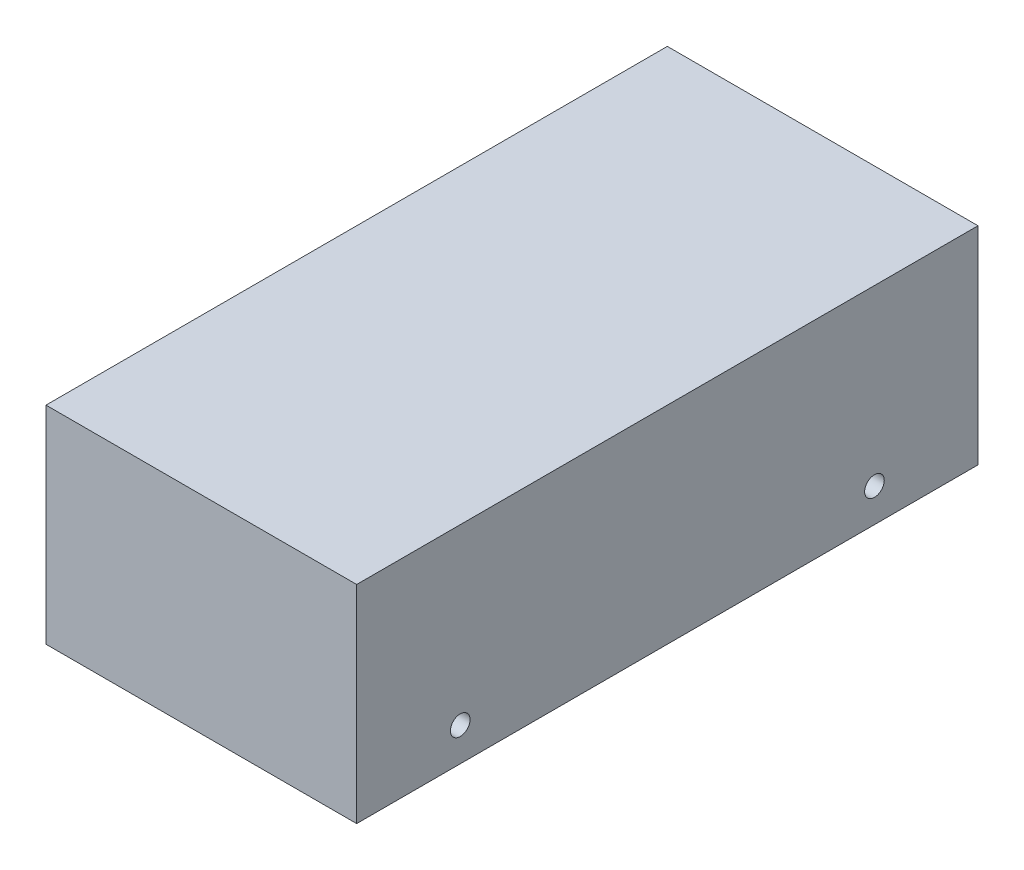
ISO-10303-21;
HEADER;
FILE_DESCRIPTION(('STEP AP214'),'2;1');
FILE_NAME('part.step','',(''),(''),'','','');
FILE_SCHEMA(('AUTOMOTIVE_DESIGN { 1 0 10303 214 1 1 1 1 }'));
ENDSEC;
DATA;
#1=APPLICATION_CONTEXT('core data for automotive mechanical design processes');
#2=APPLICATION_PROTOCOL_DEFINITION('international standard','automotive_design',2000,#1);
#3=PRODUCT_CONTEXT('',#1,'mechanical');
#4=PRODUCT('Part','Part','',(#3));
#5=PRODUCT_RELATED_PRODUCT_CATEGORY('part','',(#4));
#6=PRODUCT_DEFINITION_FORMATION('','',#4);
#7=PRODUCT_DEFINITION_CONTEXT('part definition',#1,'design');
#8=PRODUCT_DEFINITION('design','',#6,#7);
#9=PRODUCT_DEFINITION_SHAPE('','',#8);
#10=(LENGTH_UNIT() NAMED_UNIT(*) SI_UNIT(.MILLI.,.METRE.));
#11=(NAMED_UNIT(*) PLANE_ANGLE_UNIT() SI_UNIT($,.RADIAN.));
#12=(NAMED_UNIT(*) SI_UNIT($,.STERADIAN.) SOLID_ANGLE_UNIT());
#13=UNCERTAINTY_MEASURE_WITH_UNIT(LENGTH_MEASURE(1.E-05),#10,'distance_accuracy_value','');
#14=(GEOMETRIC_REPRESENTATION_CONTEXT(3) GLOBAL_UNCERTAINTY_ASSIGNED_CONTEXT((#13)) GLOBAL_UNIT_ASSIGNED_CONTEXT((#10,
#11,#12)) REPRESENTATION_CONTEXT('',''));
#15=CARTESIAN_POINT('',(0.,0.,0.));
#16=DIRECTION('',(0.,0.,1.));
#17=DIRECTION('',(1.,0.,0.));
#18=AXIS2_PLACEMENT_3D('',#15,#16,#17);
#19=CARTESIAN_POINT('',(-37.5,25.,150.));
#20=DIRECTION('',(1.,0.,0.));
#21=DIRECTION('',(0.,0.,-1.));
#22=AXIS2_PLACEMENT_3D('',#19,#20,#21);
#23=PLANE('',#22);
#24=CARTESIAN_POINT('',(-37.5,-16.9191545779192,25.));
#25=DIRECTION('',(-1.,0.,0.));
#26=DIRECTION('',(0.,0.,1.));
#27=AXIS2_PLACEMENT_3D('',#24,#25,#26);
#28=CIRCLE('',#27,2.36964720538207);
#29=CARTESIAN_POINT('',(-37.5,-16.9191545779192,27.3696472053821));
#30=VERTEX_POINT('',#29);
#31=EDGE_CURVE('E130',#30,#30,#28,.T.);
#32=ORIENTED_EDGE('',*,*,#31,.F.);
#33=EDGE_LOOP('',(#32));
#34=FACE_BOUND('',#33,.T.);
#35=CARTESIAN_POINT('',(-37.5,-16.9191545779192,125.));
#36=DIRECTION('',(-1.,0.,0.));
#37=DIRECTION('',(0.,0.,1.));
#38=AXIS2_PLACEMENT_3D('',#35,#36,#37);
#39=CIRCLE('',#38,2.36964720538208);
#40=CARTESIAN_POINT('',(-37.5,-16.9191545779192,127.369647205382));
#41=VERTEX_POINT('',#40);
#42=EDGE_CURVE('E124',#41,#41,#39,.T.);
#43=ORIENTED_EDGE('',*,*,#42,.F.);
#44=EDGE_LOOP('',(#43));
#45=FACE_BOUND('',#44,.T.);
#46=DIRECTION('',(0.,-1.,0.));
#47=VECTOR('',#46,1.);
#48=CARTESIAN_POINT('',(-37.5,25.,0.));
#49=LINE('',#48,#47);
#50=CARTESIAN_POINT('',(-37.5,25.,0.));
#51=VERTEX_POINT('',#50);
#52=CARTESIAN_POINT('',(-37.5,-25.,0.));
#53=VERTEX_POINT('',#52);
#54=EDGE_CURVE('E98',#51,#53,#49,.T.);
#55=ORIENTED_EDGE('',*,*,#54,.T.);
#56=DIRECTION('',(0.,0.,-1.));
#57=VECTOR('',#56,1.);
#58=CARTESIAN_POINT('',(-37.5,-25.,150.));
#59=LINE('',#58,#57);
#60=CARTESIAN_POINT('',(-37.5,-25.,150.));
#61=VERTEX_POINT('',#60);
#62=EDGE_CURVE('E11',#61,#53,#59,.T.);
#63=ORIENTED_EDGE('',*,*,#62,.F.);
#64=DIRECTION('',(0.,-1.,0.));
#65=VECTOR('',#64,1.);
#66=CARTESIAN_POINT('',(-37.5,25.,150.));
#67=LINE('',#66,#65);
#68=CARTESIAN_POINT('',(-37.5,25.,150.));
#69=VERTEX_POINT('',#68);
#70=EDGE_CURVE('E86',#69,#61,#67,.T.);
#71=ORIENTED_EDGE('',*,*,#70,.F.);
#72=DIRECTION('',(0.,0.,-1.));
#73=VECTOR('',#72,1.);
#74=CARTESIAN_POINT('',(-37.5,25.,150.));
#75=LINE('',#74,#73);
#76=EDGE_CURVE('E94',#69,#51,#75,.T.);
#77=ORIENTED_EDGE('',*,*,#76,.T.);
#78=EDGE_LOOP('',(#55,#63,#71,#77));
#79=FACE_BOUND('',#78,.T.);
#80=ADVANCED_FACE('F35',(#34,#45,#79),#23,.F.);
#81=CARTESIAN_POINT('',(-37.5,-25.,150.));
#82=DIRECTION('',(0.,1.,0.));
#83=DIRECTION('',(0.,0.,1.));
#84=AXIS2_PLACEMENT_3D('',#81,#82,#83);
#85=PLANE('',#84);
#86=DIRECTION('',(1.,0.,0.));
#87=VECTOR('',#86,1.);
#88=CARTESIAN_POINT('',(-37.5,-25.,0.));
#89=LINE('',#88,#87);
#90=CARTESIAN_POINT('',(37.5,-25.,0.));
#91=VERTEX_POINT('',#90);
#92=EDGE_CURVE('E90',#53,#91,#89,.T.);
#93=ORIENTED_EDGE('',*,*,#92,.T.);
#94=DIRECTION('',(0.,0.,-1.));
#95=VECTOR('',#94,1.);
#96=CARTESIAN_POINT('',(37.5,-25.,150.));
#97=LINE('',#96,#95);
#98=CARTESIAN_POINT('',(37.5,-25.,150.));
#99=VERTEX_POINT('',#98);
#100=EDGE_CURVE('E43',#99,#91,#97,.T.);
#101=ORIENTED_EDGE('',*,*,#100,.F.);
#102=DIRECTION('',(1.,0.,0.));
#103=VECTOR('',#102,1.);
#104=CARTESIAN_POINT('',(-37.5,-25.,150.));
#105=LINE('',#104,#103);
#106=EDGE_CURVE('E81',#61,#99,#105,.T.);
#107=ORIENTED_EDGE('',*,*,#106,.F.);
#108=ORIENTED_EDGE('',*,*,#62,.T.);
#109=EDGE_LOOP('',(#93,#101,#107,#108));
#110=FACE_BOUND('',#109,.T.);
#111=ADVANCED_FACE('F89',(#110),#85,.F.);
#112=CARTESIAN_POINT('',(37.5,25.,150.));
#113=DIRECTION('',(-1.,0.,0.));
#114=DIRECTION('',(0.,-1.,0.));
#115=AXIS2_PLACEMENT_3D('',#112,#113,#114);
#116=PLANE('',#115);
#117=CARTESIAN_POINT('',(37.5,-16.9191545779192,125.));
#118=DIRECTION('',(1.,0.,0.));
#119=DIRECTION('',(0.,1.,0.));
#120=AXIS2_PLACEMENT_3D('',#117,#118,#119);
#121=CIRCLE('',#120,2.36964720538207);
#122=CARTESIAN_POINT('',(37.5,-14.5495073725371,125.));
#123=VERTEX_POINT('',#122);
#124=EDGE_CURVE('E119',#123,#123,#121,.T.);
#125=ORIENTED_EDGE('',*,*,#124,.F.);
#126=EDGE_LOOP('',(#125));
#127=FACE_BOUND('',#126,.T.);
#128=CARTESIAN_POINT('',(37.5,-16.9191545779192,25.));
#129=DIRECTION('',(1.,0.,0.));
#130=DIRECTION('',(0.,1.,0.));
#131=AXIS2_PLACEMENT_3D('',#128,#129,#130);
#132=CIRCLE('',#131,2.36964720538207);
#133=CARTESIAN_POINT('',(37.5,-14.5495073725371,25.));
#134=VERTEX_POINT('',#133);
#135=EDGE_CURVE('E112',#134,#134,#132,.T.);
#136=ORIENTED_EDGE('',*,*,#135,.F.);
#137=EDGE_LOOP('',(#136));
#138=FACE_BOUND('',#137,.T.);
#139=DIRECTION('',(0.,1.,0.));
#140=VECTOR('',#139,1.);
#141=CARTESIAN_POINT('',(37.5,25.,0.));
#142=LINE('',#141,#140);
#143=CARTESIAN_POINT('',(37.5,25.,0.));
#144=VERTEX_POINT('',#143);
#145=EDGE_CURVE('E68',#91,#144,#142,.T.);
#146=ORIENTED_EDGE('',*,*,#145,.T.);
#147=DIRECTION('',(0.,0.,-1.));
#148=VECTOR('',#147,1.);
#149=CARTESIAN_POINT('',(37.5,25.,150.));
#150=LINE('',#149,#148);
#151=CARTESIAN_POINT('',(37.5,25.,150.));
#152=VERTEX_POINT('',#151);
#153=EDGE_CURVE('E91',#152,#144,#150,.T.);
#154=ORIENTED_EDGE('',*,*,#153,.F.);
#155=DIRECTION('',(0.,1.,0.));
#156=VECTOR('',#155,1.);
#157=CARTESIAN_POINT('',(37.5,25.,150.));
#158=LINE('',#157,#156);
#159=EDGE_CURVE('E84',#99,#152,#158,.T.);
#160=ORIENTED_EDGE('',*,*,#159,.F.);
#161=ORIENTED_EDGE('',*,*,#100,.T.);
#162=EDGE_LOOP('',(#146,#154,#160,#161));
#163=FACE_BOUND('',#162,.T.);
#164=ADVANCED_FACE('F92',(#127,#138,#163),#116,.F.);
#165=CARTESIAN_POINT('',(-37.5,25.,150.));
#166=DIRECTION('',(0.,-1.,0.));
#167=DIRECTION('',(0.,0.,-1.));
#168=AXIS2_PLACEMENT_3D('',#165,#166,#167);
#169=PLANE('',#168);
#170=DIRECTION('',(-1.,0.,0.));
#171=VECTOR('',#170,1.);
#172=CARTESIAN_POINT('',(-37.5,25.,0.));
#173=LINE('',#172,#171);
#174=EDGE_CURVE('E74',#144,#51,#173,.T.);
#175=ORIENTED_EDGE('',*,*,#174,.T.);
#176=ORIENTED_EDGE('',*,*,#76,.F.);
#177=DIRECTION('',(-1.,0.,0.));
#178=VECTOR('',#177,1.);
#179=CARTESIAN_POINT('',(-37.5,25.,150.));
#180=LINE('',#179,#178);
#181=EDGE_CURVE('E51',#152,#69,#180,.T.);
#182=ORIENTED_EDGE('',*,*,#181,.F.);
#183=ORIENTED_EDGE('',*,*,#153,.T.);
#184=EDGE_LOOP('',(#175,#176,#182,#183));
#185=FACE_BOUND('',#184,.T.);
#186=ADVANCED_FACE('F106',(#185),#169,.F.);
#187=CARTESIAN_POINT('',(0.,0.,150.));
#188=DIRECTION('',(0.,0.,1.));
#189=DIRECTION('',(1.,0.,0.));
#190=AXIS2_PLACEMENT_3D('',#187,#188,#189);
#191=PLANE('',#190);
#192=ORIENTED_EDGE('',*,*,#70,.T.);
#193=ORIENTED_EDGE('',*,*,#106,.T.);
#194=ORIENTED_EDGE('',*,*,#159,.T.);
#195=ORIENTED_EDGE('',*,*,#181,.T.);
#196=EDGE_LOOP('',(#192,#193,#194,#195));
#197=FACE_BOUND('',#196,.T.);
#198=ADVANCED_FACE('F82',(#197),#191,.T.);
#199=CARTESIAN_POINT('',(0.,0.,0.));
#200=DIRECTION('',(0.,0.,1.));
#201=DIRECTION('',(1.,0.,0.));
#202=AXIS2_PLACEMENT_3D('',#199,#200,#201);
#203=PLANE('',#202);
#204=ORIENTED_EDGE('',*,*,#54,.F.);
#205=ORIENTED_EDGE('',*,*,#174,.F.);
#206=ORIENTED_EDGE('',*,*,#145,.F.);
#207=ORIENTED_EDGE('',*,*,#92,.F.);
#208=EDGE_LOOP('',(#204,#205,#206,#207));
#209=FACE_BOUND('',#208,.T.);
#210=ADVANCED_FACE('F109',(#209),#203,.F.);
#211=CARTESIAN_POINT('',(27.5,-16.9191545779192,25.));
#212=DIRECTION('',(1.,0.,0.));
#213=DIRECTION('',(0.,1.,0.));
#214=AXIS2_PLACEMENT_3D('',#211,#212,#213);
#215=CYLINDRICAL_SURFACE('',#214,2.36964720538207);
#216=CARTESIAN_POINT('',(27.5,-16.9191545779192,25.));
#217=DIRECTION('',(1.,0.,0.));
#218=DIRECTION('',(0.,1.,0.));
#219=AXIS2_PLACEMENT_3D('',#216,#217,#218);
#220=CIRCLE('',#219,2.36964720538207);
#221=CARTESIAN_POINT('',(27.5,-14.5495073725371,25.));
#222=VERTEX_POINT('',#221);
#223=EDGE_CURVE('E115',#222,#222,#220,.T.);
#224=ORIENTED_EDGE('',*,*,#223,.F.);
#225=EDGE_LOOP('',(#224));
#226=FACE_BOUND('',#225,.T.);
#227=ORIENTED_EDGE('',*,*,#135,.T.);
#228=EDGE_LOOP('',(#227));
#229=FACE_BOUND('',#228,.T.);
#230=ADVANCED_FACE('F171',(#226,#229),#215,.F.);
#231=CARTESIAN_POINT('',(27.5,-16.9191545779192,25.));
#232=DIRECTION('',(1.,0.,0.));
#233=DIRECTION('',(0.,1.,0.));
#234=AXIS2_PLACEMENT_3D('',#231,#232,#233);
#235=PLANE('',#234);
#236=ORIENTED_EDGE('',*,*,#223,.T.);
#237=EDGE_LOOP('',(#236));
#238=FACE_BOUND('',#237,.T.);
#239=ADVANCED_FACE('F167',(#238),#235,.T.);
#240=CARTESIAN_POINT('',(27.5,-16.9191545779192,125.));
#241=DIRECTION('',(1.,0.,0.));
#242=DIRECTION('',(0.,1.,0.));
#243=AXIS2_PLACEMENT_3D('',#240,#241,#242);
#244=CYLINDRICAL_SURFACE('',#243,2.36964720538207);
#245=CARTESIAN_POINT('',(27.5,-16.9191545779192,125.));
#246=DIRECTION('',(1.,0.,0.));
#247=DIRECTION('',(0.,1.,0.));
#248=AXIS2_PLACEMENT_3D('',#245,#246,#247);
#249=CIRCLE('',#248,2.36964720538207);
#250=CARTESIAN_POINT('',(27.5,-14.5495073725371,125.));
#251=VERTEX_POINT('',#250);
#252=EDGE_CURVE('E101',#251,#251,#249,.T.);
#253=ORIENTED_EDGE('',*,*,#252,.F.);
#254=EDGE_LOOP('',(#253));
#255=FACE_BOUND('',#254,.T.);
#256=ORIENTED_EDGE('',*,*,#124,.T.);
#257=EDGE_LOOP('',(#256));
#258=FACE_BOUND('',#257,.T.);
#259=ADVANCED_FACE('F160',(#255,#258),#244,.F.);
#260=CARTESIAN_POINT('',(27.5,-16.9191545779192,125.));
#261=DIRECTION('',(1.,0.,0.));
#262=DIRECTION('',(0.,1.,0.));
#263=AXIS2_PLACEMENT_3D('',#260,#261,#262);
#264=PLANE('',#263);
#265=ORIENTED_EDGE('',*,*,#252,.T.);
#266=EDGE_LOOP('',(#265));
#267=FACE_BOUND('',#266,.T.);
#268=ADVANCED_FACE('F151',(#267),#264,.T.);
#269=CARTESIAN_POINT('',(-27.5,-16.9191545779192,125.));
#270=DIRECTION('',(-1.,0.,0.));
#271=DIRECTION('',(0.,0.,1.));
#272=AXIS2_PLACEMENT_3D('',#269,#270,#271);
#273=CYLINDRICAL_SURFACE('',#272,2.36964720538208);
#274=CARTESIAN_POINT('',(-27.5,-16.9191545779192,125.));
#275=DIRECTION('',(-1.,0.,0.));
#276=DIRECTION('',(0.,0.,1.));
#277=AXIS2_PLACEMENT_3D('',#274,#275,#276);
#278=CIRCLE('',#277,2.36964720538208);
#279=CARTESIAN_POINT('',(-27.5,-16.9191545779192,127.369647205382));
#280=VERTEX_POINT('',#279);
#281=EDGE_CURVE('E127',#280,#280,#278,.T.);
#282=ORIENTED_EDGE('',*,*,#281,.F.);
#283=EDGE_LOOP('',(#282));
#284=FACE_BOUND('',#283,.T.);
#285=ORIENTED_EDGE('',*,*,#42,.T.);
#286=EDGE_LOOP('',(#285));
#287=FACE_BOUND('',#286,.T.);
#288=ADVANCED_FACE('F149',(#284,#287),#273,.F.);
#289=CARTESIAN_POINT('',(-27.5,-16.9191545779192,125.));
#290=DIRECTION('',(-1.,0.,0.));
#291=DIRECTION('',(0.,0.,1.));
#292=AXIS2_PLACEMENT_3D('',#289,#290,#291);
#293=PLANE('',#292);
#294=ORIENTED_EDGE('',*,*,#281,.T.);
#295=EDGE_LOOP('',(#294));
#296=FACE_BOUND('',#295,.T.);
#297=ADVANCED_FACE('F141',(#296),#293,.T.);
#298=CARTESIAN_POINT('',(-27.5,-16.9191545779192,25.));
#299=DIRECTION('',(-1.,0.,0.));
#300=DIRECTION('',(0.,0.,1.));
#301=AXIS2_PLACEMENT_3D('',#298,#299,#300);
#302=CYLINDRICAL_SURFACE('',#301,2.36964720538207);
#303=CARTESIAN_POINT('',(-27.5,-16.9191545779192,25.));
#304=DIRECTION('',(-1.,0.,0.));
#305=DIRECTION('',(0.,0.,1.));
#306=AXIS2_PLACEMENT_3D('',#303,#304,#305);
#307=CIRCLE('',#306,2.36964720538207);
#308=CARTESIAN_POINT('',(-27.5,-16.9191545779192,27.3696472053821));
#309=VERTEX_POINT('',#308);
#310=EDGE_CURVE('E116',#309,#309,#307,.T.);
#311=ORIENTED_EDGE('',*,*,#310,.F.);
#312=EDGE_LOOP('',(#311));
#313=FACE_BOUND('',#312,.T.);
#314=ORIENTED_EDGE('',*,*,#31,.T.);
#315=EDGE_LOOP('',(#314));
#316=FACE_BOUND('',#315,.T.);
#317=ADVANCED_FACE('F138',(#313,#316),#302,.F.);
#318=CARTESIAN_POINT('',(-27.5,-16.9191545779192,25.));
#319=DIRECTION('',(-1.,0.,0.));
#320=DIRECTION('',(0.,0.,1.));
#321=AXIS2_PLACEMENT_3D('',#318,#319,#320);
#322=PLANE('',#321);
#323=ORIENTED_EDGE('',*,*,#310,.T.);
#324=EDGE_LOOP('',(#323));
#325=FACE_BOUND('',#324,.T.);
#326=ADVANCED_FACE('F136',(#325),#322,.T.);
#327=CLOSED_SHELL('',(#80,#111,#164,#186,#198,#210,#230,#239,#259,#268,#288,#297,#317,#326));
#328=MANIFOLD_SOLID_BREP('B2',#327);
#329=ADVANCED_BREP_SHAPE_REPRESENTATION('',(#18,#328),#14);
#330=SHAPE_DEFINITION_REPRESENTATION(#9,#329);
ENDSEC;
END-ISO-10303-21;
